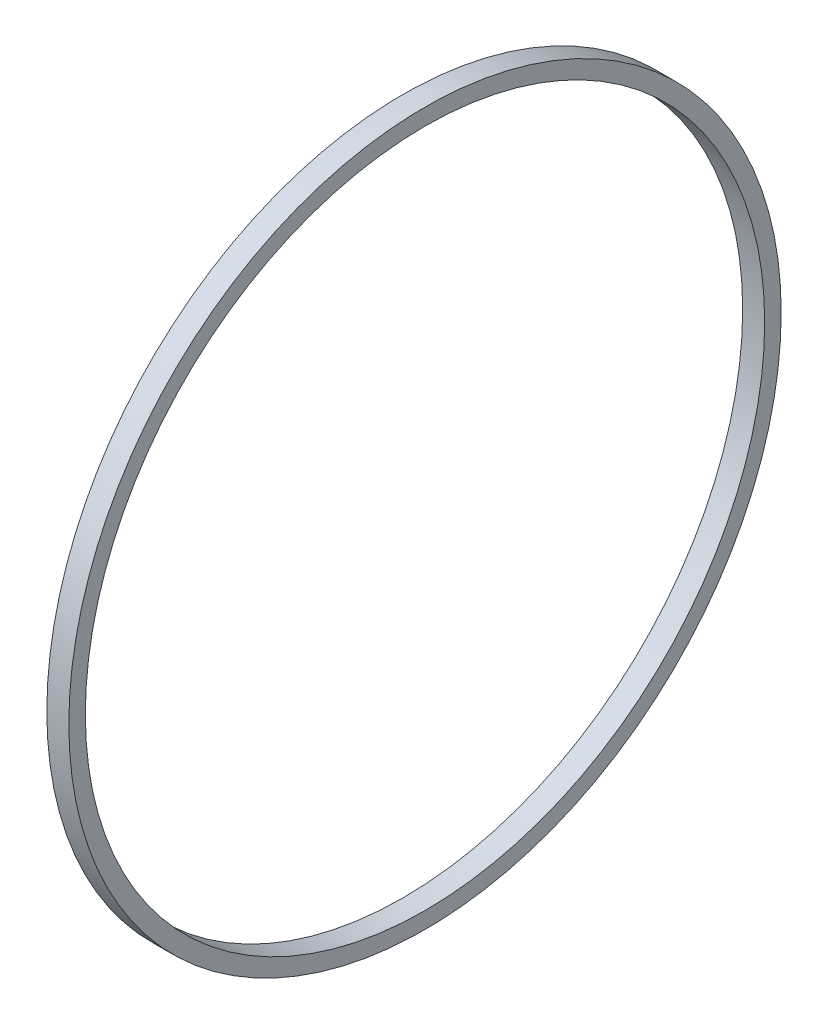
ISO-10303-21;
HEADER;
FILE_DESCRIPTION(('STEP AP214'),'2;1');
FILE_NAME('part.step','',(''),(''),'','','');
FILE_SCHEMA(('AUTOMOTIVE_DESIGN { 1 0 10303 214 1 1 1 1 }'));
ENDSEC;
DATA;
#1=APPLICATION_CONTEXT('core data for automotive mechanical design processes');
#2=APPLICATION_PROTOCOL_DEFINITION('international standard','automotive_design',2000,#1);
#3=PRODUCT_CONTEXT('',#1,'mechanical');
#4=PRODUCT('Part','Part','',(#3));
#5=PRODUCT_RELATED_PRODUCT_CATEGORY('part','',(#4));
#6=PRODUCT_DEFINITION_FORMATION('','',#4);
#7=PRODUCT_DEFINITION_CONTEXT('part definition',#1,'design');
#8=PRODUCT_DEFINITION('design','',#6,#7);
#9=PRODUCT_DEFINITION_SHAPE('','',#8);
#10=(LENGTH_UNIT() NAMED_UNIT(*) SI_UNIT(.MILLI.,.METRE.));
#11=(NAMED_UNIT(*) PLANE_ANGLE_UNIT() SI_UNIT($,.RADIAN.));
#12=(NAMED_UNIT(*) SI_UNIT($,.STERADIAN.) SOLID_ANGLE_UNIT());
#13=UNCERTAINTY_MEASURE_WITH_UNIT(LENGTH_MEASURE(1.E-05),#10,'distance_accuracy_value','');
#14=(GEOMETRIC_REPRESENTATION_CONTEXT(3) GLOBAL_UNCERTAINTY_ASSIGNED_CONTEXT((#13)) GLOBAL_UNIT_ASSIGNED_CONTEXT((#10,
#11,#12)) REPRESENTATION_CONTEXT('',''));
#15=CARTESIAN_POINT('',(0.,0.,0.));
#16=DIRECTION('',(0.,0.,1.));
#17=DIRECTION('',(1.,0.,0.));
#18=AXIS2_PLACEMENT_3D('',#15,#16,#17);
#19=CARTESIAN_POINT('',(3.175,102.7625,0.));
#20=DIRECTION('',(-1.,0.,0.));
#21=DIRECTION('',(0.,0.,1.));
#22=AXIS2_PLACEMENT_3D('',#19,#20,#21);
#23=PLANE('',#22);
#24=CARTESIAN_POINT('',(3.175,0.,0.));
#25=DIRECTION('',(-1.,0.,0.));
#26=DIRECTION('',(0.,0.,1.));
#27=AXIS2_PLACEMENT_3D('',#24,#25,#26);
#28=CIRCLE('',#27,102.7625);
#29=CARTESIAN_POINT('',(3.175,0.,102.7625));
#30=VERTEX_POINT('',#29);
#31=EDGE_CURVE('E10',#30,#30,#28,.T.);
#32=ORIENTED_EDGE('',*,*,#31,.F.);
#33=EDGE_LOOP('',(#32));
#34=FACE_BOUND('',#33,.T.);
#35=CARTESIAN_POINT('',(3.175,0.,0.));
#36=DIRECTION('',(-1.,0.,0.));
#37=DIRECTION('',(0.,0.,1.));
#38=AXIS2_PLACEMENT_3D('',#35,#36,#37);
#39=CIRCLE('',#38,98.);
#40=CARTESIAN_POINT('',(3.175,0.,98.));
#41=VERTEX_POINT('',#40);
#42=EDGE_CURVE('E44',#41,#41,#39,.T.);
#43=ORIENTED_EDGE('',*,*,#42,.T.);
#44=EDGE_LOOP('',(#43));
#45=FACE_BOUND('',#44,.T.);
#46=ADVANCED_FACE('F30',(#34,#45),#23,.F.);
#47=CARTESIAN_POINT('',(0.,0.,0.));
#48=DIRECTION('',(-1.,0.,0.));
#49=DIRECTION('',(0.,0.,1.));
#50=AXIS2_PLACEMENT_3D('',#47,#48,#49);
#51=CYLINDRICAL_SURFACE('',#50,102.7625);
#52=CARTESIAN_POINT('',(-3.175,0.,0.));
#53=DIRECTION('',(-1.,0.,0.));
#54=DIRECTION('',(0.,0.,1.));
#55=AXIS2_PLACEMENT_3D('',#52,#53,#54);
#56=CIRCLE('',#55,102.7625);
#57=CARTESIAN_POINT('',(-3.175,0.,102.7625));
#58=VERTEX_POINT('',#57);
#59=EDGE_CURVE('E36',#58,#58,#56,.T.);
#60=ORIENTED_EDGE('',*,*,#59,.F.);
#61=EDGE_LOOP('',(#60));
#62=FACE_BOUND('',#61,.T.);
#63=ORIENTED_EDGE('',*,*,#31,.T.);
#64=EDGE_LOOP('',(#63));
#65=FACE_BOUND('',#64,.T.);
#66=ADVANCED_FACE('F59',(#62,#65),#51,.T.);
#67=CARTESIAN_POINT('',(-3.175,102.7625,0.));
#68=DIRECTION('',(1.,0.,0.));
#69=DIRECTION('',(0.,0.,-1.));
#70=AXIS2_PLACEMENT_3D('',#67,#68,#69);
#71=PLANE('',#70);
#72=CARTESIAN_POINT('',(-3.175,0.,0.));
#73=DIRECTION('',(-1.,0.,0.));
#74=DIRECTION('',(0.,0.,1.));
#75=AXIS2_PLACEMENT_3D('',#72,#73,#74);
#76=CIRCLE('',#75,98.);
#77=CARTESIAN_POINT('',(-3.175,0.,98.));
#78=VERTEX_POINT('',#77);
#79=EDGE_CURVE('E40',#78,#78,#76,.T.);
#80=ORIENTED_EDGE('',*,*,#79,.F.);
#81=EDGE_LOOP('',(#80));
#82=FACE_BOUND('',#81,.T.);
#83=ORIENTED_EDGE('',*,*,#59,.T.);
#84=EDGE_LOOP('',(#83));
#85=FACE_BOUND('',#84,.T.);
#86=ADVANCED_FACE('F54',(#82,#85),#71,.F.);
#87=CARTESIAN_POINT('',(0.,0.,0.));
#88=DIRECTION('',(-1.,0.,0.));
#89=DIRECTION('',(0.,0.,1.));
#90=AXIS2_PLACEMENT_3D('',#87,#88,#89);
#91=CYLINDRICAL_SURFACE('',#90,98.);
#92=ORIENTED_EDGE('',*,*,#42,.F.);
#93=EDGE_LOOP('',(#92));
#94=FACE_BOUND('',#93,.T.);
#95=ORIENTED_EDGE('',*,*,#79,.T.);
#96=EDGE_LOOP('',(#95));
#97=FACE_BOUND('',#96,.T.);
#98=ADVANCED_FACE('F51',(#94,#97),#91,.F.);
#99=CLOSED_SHELL('',(#46,#66,#86,#98));
#100=MANIFOLD_SOLID_BREP('B2',#99);
#101=ADVANCED_BREP_SHAPE_REPRESENTATION('',(#18,#100),#14);
#102=SHAPE_DEFINITION_REPRESENTATION(#9,#101);
ENDSEC;
END-ISO-10303-21;
